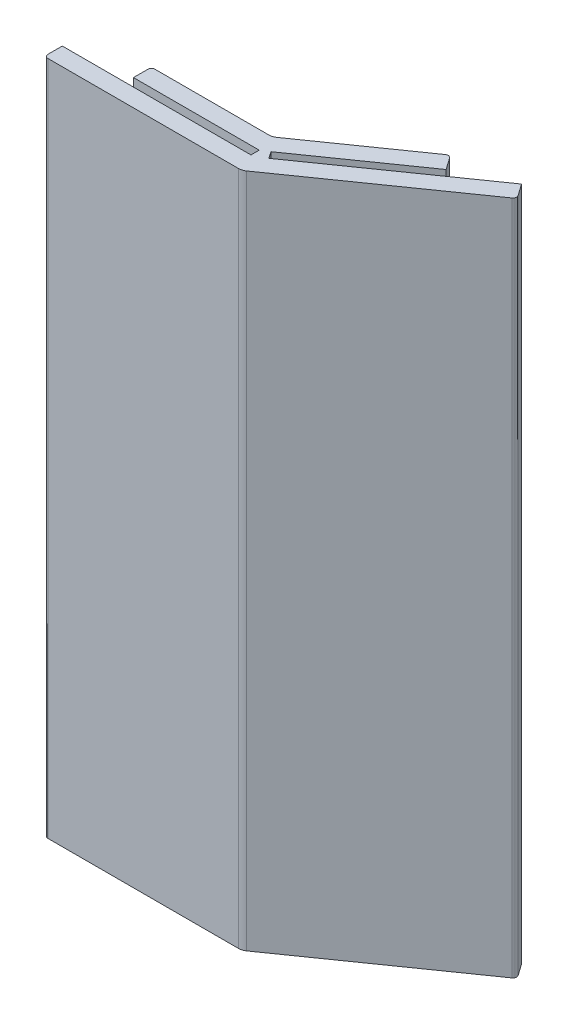
ISO-10303-21;
HEADER;
FILE_DESCRIPTION(('STEP AP214'),'2;1');
FILE_NAME('part.step','',(''),(''),'','','');
FILE_SCHEMA(('AUTOMOTIVE_DESIGN { 1 0 10303 214 1 1 1 1 }'));
ENDSEC;
DATA;
#1=APPLICATION_CONTEXT('core data for automotive mechanical design processes');
#2=APPLICATION_PROTOCOL_DEFINITION('international standard','automotive_design',2000,#1);
#3=PRODUCT_CONTEXT('',#1,'mechanical');
#4=PRODUCT('Part','Part','',(#3));
#5=PRODUCT_RELATED_PRODUCT_CATEGORY('part','',(#4));
#6=PRODUCT_DEFINITION_FORMATION('','',#4);
#7=PRODUCT_DEFINITION_CONTEXT('part definition',#1,'design');
#8=PRODUCT_DEFINITION('design','',#6,#7);
#9=PRODUCT_DEFINITION_SHAPE('','',#8);
#10=(LENGTH_UNIT() NAMED_UNIT(*) SI_UNIT(.MILLI.,.METRE.));
#11=(NAMED_UNIT(*) PLANE_ANGLE_UNIT() SI_UNIT($,.RADIAN.));
#12=(NAMED_UNIT(*) SI_UNIT($,.STERADIAN.) SOLID_ANGLE_UNIT());
#13=UNCERTAINTY_MEASURE_WITH_UNIT(LENGTH_MEASURE(1.E-05),#10,'distance_accuracy_value','');
#14=(GEOMETRIC_REPRESENTATION_CONTEXT(3) GLOBAL_UNCERTAINTY_ASSIGNED_CONTEXT((#13)) GLOBAL_UNIT_ASSIGNED_CONTEXT((#10,
#11,#12)) REPRESENTATION_CONTEXT('',''));
#15=CARTESIAN_POINT('',(0.,0.,0.));
#16=DIRECTION('',(0.,0.,1.));
#17=DIRECTION('',(1.,0.,0.));
#18=AXIS2_PLACEMENT_3D('',#15,#16,#17);
#19=CARTESIAN_POINT('',(-55.,188.,-4.99999999999999));
#20=DIRECTION('',(0.,0.,1.));
#21=DIRECTION('',(1.,0.,0.));
#22=AXIS2_PLACEMENT_3D('',#19,#20,#21);
#23=PLANE('',#22);
#24=DIRECTION('',(-1.,0.,0.));
#25=VECTOR('',#24,1.);
#26=CARTESIAN_POINT('',(-55.,0.,-4.99999999999999));
#27=LINE('',#26,#25);
#28=CARTESIAN_POINT('',(-2.48760437909547,0.,-4.99999999999999));
#29=VERTEX_POINT('',#28);
#30=CARTESIAN_POINT('',(-55.,0.,-4.99999999999999));
#31=VERTEX_POINT('',#30);
#32=EDGE_CURVE('E202',#29,#31,#27,.T.);
#33=ORIENTED_EDGE('',*,*,#32,.T.);
#34=DIRECTION('',(0.,-1.,0.));
#35=VECTOR('',#34,1.);
#36=CARTESIAN_POINT('',(-55.,188.,-4.99999999999999));
#37=LINE('',#36,#35);
#38=CARTESIAN_POINT('',(-55.,188.,-4.99999999999999));
#39=VERTEX_POINT('',#38);
#40=EDGE_CURVE('E11',#39,#31,#37,.T.);
#41=ORIENTED_EDGE('',*,*,#40,.F.);
#42=DIRECTION('',(-1.,0.,0.));
#43=VECTOR('',#42,1.);
#44=CARTESIAN_POINT('',(-55.,188.,-4.99999999999999));
#45=LINE('',#44,#43);
#46=CARTESIAN_POINT('',(-2.48760437909547,188.,-4.99999999999999));
#47=VERTEX_POINT('',#46);
#48=EDGE_CURVE('E240',#47,#39,#45,.T.);
#49=ORIENTED_EDGE('',*,*,#48,.F.);
#50=DIRECTION('',(0.,-1.,0.));
#51=VECTOR('',#50,1.);
#52=CARTESIAN_POINT('',(-2.48760437909547,188.,-4.99999999999999));
#53=LINE('',#52,#51);
#54=EDGE_CURVE('E198',#47,#29,#53,.T.);
#55=ORIENTED_EDGE('',*,*,#54,.T.);
#56=EDGE_LOOP('',(#33,#41,#49,#55));
#57=FACE_BOUND('',#56,.T.);
#58=ADVANCED_FACE('F34',(#57),#23,.F.);
#59=CARTESIAN_POINT('',(-55.,188.,-0.999999999999994));
#60=DIRECTION('',(1.,0.,0.));
#61=DIRECTION('',(0.,0.,-1.));
#62=AXIS2_PLACEMENT_3D('',#59,#60,#61);
#63=PLANE('',#62);
#64=DIRECTION('',(0.,0.,1.));
#65=VECTOR('',#64,1.);
#66=CARTESIAN_POINT('',(-55.,0.,-0.999999999999994));
#67=LINE('',#66,#65);
#68=CARTESIAN_POINT('',(-55.,0.,-0.999999999999994));
#69=VERTEX_POINT('',#68);
#70=EDGE_CURVE('E205',#31,#69,#67,.T.);
#71=ORIENTED_EDGE('',*,*,#70,.T.);
#72=DIRECTION('',(0.,-1.,0.));
#73=VECTOR('',#72,1.);
#74=CARTESIAN_POINT('',(-55.,188.,-0.999999999999994));
#75=LINE('',#74,#73);
#76=CARTESIAN_POINT('',(-55.,188.,-0.999999999999994));
#77=VERTEX_POINT('',#76);
#78=EDGE_CURVE('E42',#77,#69,#75,.T.);
#79=ORIENTED_EDGE('',*,*,#78,.F.);
#80=DIRECTION('',(0.,0.,1.));
#81=VECTOR('',#80,1.);
#82=CARTESIAN_POINT('',(-55.,188.,-0.999999999999994));
#83=LINE('',#82,#81);
#84=EDGE_CURVE('E129',#39,#77,#83,.T.);
#85=ORIENTED_EDGE('',*,*,#84,.F.);
#86=ORIENTED_EDGE('',*,*,#40,.T.);
#87=EDGE_LOOP('',(#71,#79,#85,#86));
#88=FACE_BOUND('',#87,.T.);
#89=ADVANCED_FACE('F358',(#88),#63,.F.);
#90=CARTESIAN_POINT('',(-54.,188.,-0.999999999999994));
#91=DIRECTION('',(0.,-1.,0.));
#92=DIRECTION('',(0.,0.,-1.));
#93=AXIS2_PLACEMENT_3D('',#90,#91,#92);
#94=CYLINDRICAL_SURFACE('',#93,1.);
#95=CARTESIAN_POINT('',(-54.,0.,-0.999999999999994));
#96=DIRECTION('',(0.,1.,0.));
#97=DIRECTION('',(0.,0.,1.));
#98=AXIS2_PLACEMENT_3D('',#95,#96,#97);
#99=CIRCLE('',#98,1.);
#100=CARTESIAN_POINT('',(-54.,0.,0.));
#101=VERTEX_POINT('',#100);
#102=EDGE_CURVE('E207',#69,#101,#99,.T.);
#103=ORIENTED_EDGE('',*,*,#102,.T.);
#104=DIRECTION('',(0.,-1.,0.));
#105=VECTOR('',#104,1.);
#106=CARTESIAN_POINT('',(-54.,188.,0.));
#107=LINE('',#106,#105);
#108=CARTESIAN_POINT('',(-54.,188.,0.));
#109=VERTEX_POINT('',#108);
#110=EDGE_CURVE('E283',#109,#101,#107,.T.);
#111=ORIENTED_EDGE('',*,*,#110,.F.);
#112=CARTESIAN_POINT('',(-54.,188.,-0.999999999999994));
#113=DIRECTION('',(0.,1.,0.));
#114=DIRECTION('',(0.,0.,1.));
#115=AXIS2_PLACEMENT_3D('',#112,#113,#114);
#116=CIRCLE('',#115,1.);
#117=EDGE_CURVE('E291',#77,#109,#116,.T.);
#118=ORIENTED_EDGE('',*,*,#117,.F.);
#119=ORIENTED_EDGE('',*,*,#78,.T.);
#120=EDGE_LOOP('',(#103,#111,#118,#119));
#121=FACE_BOUND('',#120,.T.);
#122=ADVANCED_FACE('F289',(#121),#94,.T.);
#123=CARTESIAN_POINT('',(-0.945896366636942,188.,0.));
#124=DIRECTION('',(0.,0.,-1.));
#125=DIRECTION('',(-1.,0.,0.));
#126=AXIS2_PLACEMENT_3D('',#123,#124,#125);
#127=PLANE('',#126);
#128=DIRECTION('',(1.,0.,0.));
#129=VECTOR('',#128,1.);
#130=CARTESIAN_POINT('',(-0.945896366636942,0.,0.));
#131=LINE('',#130,#129);
#132=CARTESIAN_POINT('',(-0.945896366636942,0.,0.));
#133=VERTEX_POINT('',#132);
#134=EDGE_CURVE('E209',#101,#133,#131,.T.);
#135=ORIENTED_EDGE('',*,*,#134,.T.);
#136=DIRECTION('',(0.,-1.,0.));
#137=VECTOR('',#136,1.);
#138=CARTESIAN_POINT('',(-0.945896366636942,188.,0.));
#139=LINE('',#138,#137);
#140=CARTESIAN_POINT('',(-0.945896366636942,188.,0.));
#141=VERTEX_POINT('',#140);
#142=EDGE_CURVE('E280',#141,#133,#139,.T.);
#143=ORIENTED_EDGE('',*,*,#142,.F.);
#144=DIRECTION('',(1.,0.,0.));
#145=VECTOR('',#144,1.);
#146=CARTESIAN_POINT('',(-0.945896366636942,188.,0.));
#147=LINE('',#146,#145);
#148=EDGE_CURVE('E309',#109,#141,#147,.T.);
#149=ORIENTED_EDGE('',*,*,#148,.F.);
#150=ORIENTED_EDGE('',*,*,#110,.T.);
#151=EDGE_LOOP('',(#135,#143,#149,#150));
#152=FACE_BOUND('',#151,.T.);
#153=ADVANCED_FACE('F300',(#152),#127,.F.);
#154=CARTESIAN_POINT('',(-0.945896366636942,188.,-3.));
#155=DIRECTION('',(0.,-1.,0.));
#156=DIRECTION('',(0.,0.,-1.));
#157=AXIS2_PLACEMENT_3D('',#154,#155,#156);
#158=CYLINDRICAL_SURFACE('',#157,3.);
#159=CARTESIAN_POINT('',(-0.945896366636942,0.,-3.));
#160=DIRECTION('',(0.,1.,0.));
#161=DIRECTION('',(0.,0.,-1.));
#162=AXIS2_PLACEMENT_3D('',#159,#160,#161);
#163=CIRCLE('',#162,3.);
#164=CARTESIAN_POINT('',(0.774832942416184,0.,-0.542543867133016));
#165=VERTEX_POINT('',#164);
#166=EDGE_CURVE('E211',#133,#165,#163,.T.);
#167=ORIENTED_EDGE('',*,*,#166,.T.);
#168=DIRECTION('',(0.,-1.,0.));
#169=VECTOR('',#168,1.);
#170=CARTESIAN_POINT('',(0.774832942416184,188.,-0.542543867133016));
#171=LINE('',#170,#169);
#172=CARTESIAN_POINT('',(0.774832942416184,188.,-0.542543867133016));
#173=VERTEX_POINT('',#172);
#174=EDGE_CURVE('E277',#173,#165,#171,.T.);
#175=ORIENTED_EDGE('',*,*,#174,.F.);
#176=CARTESIAN_POINT('',(-0.945896366636942,188.,-3.));
#177=DIRECTION('',(0.,1.,0.));
#178=DIRECTION('',(0.,0.,-1.));
#179=AXIS2_PLACEMENT_3D('',#176,#177,#178);
#180=CIRCLE('',#179,3.);
#181=EDGE_CURVE('E306',#141,#173,#180,.T.);
#182=ORIENTED_EDGE('',*,*,#181,.F.);
#183=ORIENTED_EDGE('',*,*,#142,.T.);
#184=EDGE_LOOP('',(#167,#175,#182,#183));
#185=FACE_BOUND('',#184,.T.);
#186=ADVANCED_FACE('F304',(#185),#158,.T.);
#187=CARTESIAN_POINT('',(0.774832942416183,188.,-0.542543867133016));
#188=DIRECTION('',(-0.573576436351042,0.,-0.819152044288995));
#189=DIRECTION('',(-0.819152044288995,0.,0.573576436351042));
#190=AXIS2_PLACEMENT_3D('',#187,#188,#189);
#191=PLANE('',#190);
#192=DIRECTION('',(0.819152044288995,0.,-0.573576436351042));
#193=VECTOR('',#192,1.);
#194=CARTESIAN_POINT('',(0.774832942416183,0.,-0.542543867133016));
#195=LINE('',#194,#193);
#196=CARTESIAN_POINT('',(44.2342103916057,0.,-30.9731275629563));
#197=VERTEX_POINT('',#196);
#198=EDGE_CURVE('E213',#165,#197,#195,.T.);
#199=ORIENTED_EDGE('',*,*,#198,.T.);
#200=DIRECTION('',(0.,-1.,0.));
#201=VECTOR('',#200,1.);
#202=CARTESIAN_POINT('',(44.2342103916057,188.,-30.9731275629563));
#203=LINE('',#202,#201);
#204=CARTESIAN_POINT('',(44.2342103916057,188.,-30.9731275629563));
#205=VERTEX_POINT('',#204);
#206=EDGE_CURVE('E274',#205,#197,#203,.T.);
#207=ORIENTED_EDGE('',*,*,#206,.F.);
#208=DIRECTION('',(0.819152044288995,0.,-0.573576436351042));
#209=VECTOR('',#208,1.);
#210=CARTESIAN_POINT('',(0.774832942416183,188.,-0.542543867133016));
#211=LINE('',#210,#209);
#212=EDGE_CURVE('E308',#173,#205,#211,.T.);
#213=ORIENTED_EDGE('',*,*,#212,.F.);
#214=ORIENTED_EDGE('',*,*,#174,.T.);
#215=EDGE_LOOP('',(#199,#207,#213,#214));
#216=FACE_BOUND('',#215,.T.);
#217=ADVANCED_FACE('F371',(#216),#191,.F.);
#218=CARTESIAN_POINT('',(43.6606339552547,188.,-31.7922796072453));
#219=DIRECTION('',(0.,-1.,0.));
#220=DIRECTION('',(0.,0.,-1.));
#221=AXIS2_PLACEMENT_3D('',#218,#219,#220);
#222=CYLINDRICAL_SURFACE('',#221,0.999999999999994);
#223=CARTESIAN_POINT('',(43.6606339552547,0.,-31.7922796072453));
#224=DIRECTION('',(0.,1.,0.));
#225=DIRECTION('',(0.,0.,1.));
#226=AXIS2_PLACEMENT_3D('',#223,#224,#225);
#227=CIRCLE('',#226,0.999999999999994);
#228=CARTESIAN_POINT('',(44.4797859995437,0.,-32.3658560435963));
#229=VERTEX_POINT('',#228);
#230=EDGE_CURVE('E215',#197,#229,#227,.T.);
#231=ORIENTED_EDGE('',*,*,#230,.T.);
#232=DIRECTION('',(0.,-1.,0.));
#233=VECTOR('',#232,1.);
#234=CARTESIAN_POINT('',(44.4797859995437,188.,-32.3658560435963));
#235=LINE('',#234,#233);
#236=CARTESIAN_POINT('',(44.4797859995437,188.,-32.3658560435963));
#237=VERTEX_POINT('',#236);
#238=EDGE_CURVE('E271',#237,#229,#235,.T.);
#239=ORIENTED_EDGE('',*,*,#238,.F.);
#240=CARTESIAN_POINT('',(43.6606339552547,188.,-31.7922796072453));
#241=DIRECTION('',(0.,1.,0.));
#242=DIRECTION('',(0.,0.,1.));
#243=AXIS2_PLACEMENT_3D('',#240,#241,#242);
#244=CIRCLE('',#243,0.999999999999994);
#245=EDGE_CURVE('E311',#205,#237,#244,.T.);
#246=ORIENTED_EDGE('',*,*,#245,.F.);
#247=ORIENTED_EDGE('',*,*,#206,.T.);
#248=EDGE_LOOP('',(#231,#239,#246,#247));
#249=FACE_BOUND('',#248,.T.);
#250=ADVANCED_FACE('F374',(#249),#222,.T.);
#251=CARTESIAN_POINT('',(42.1854802541395,188.,-35.6424642207523));
#252=DIRECTION('',(-0.819152044288995,0.,0.573576436351042));
#253=DIRECTION('',(0.573576436351042,0.,0.819152044288995));
#254=AXIS2_PLACEMENT_3D('',#251,#252,#253);
#255=PLANE('',#254);
#256=DIRECTION('',(-0.573576436351042,0.,-0.819152044288995));
#257=VECTOR('',#256,1.);
#258=CARTESIAN_POINT('',(42.1854802541395,0.,-35.6424642207523));
#259=LINE('',#258,#257);
#260=CARTESIAN_POINT('',(42.1854802541395,0.,-35.6424642207523));
#261=VERTEX_POINT('',#260);
#262=EDGE_CURVE('E217',#229,#261,#259,.T.);
#263=ORIENTED_EDGE('',*,*,#262,.T.);
#264=DIRECTION('',(0.,-1.,0.));
#265=VECTOR('',#264,1.);
#266=CARTESIAN_POINT('',(42.1854802541395,188.,-35.6424642207523));
#267=LINE('',#266,#265);
#268=CARTESIAN_POINT('',(42.1854802541395,188.,-35.6424642207523));
#269=VERTEX_POINT('',#268);
#270=EDGE_CURVE('E268',#269,#261,#267,.T.);
#271=ORIENTED_EDGE('',*,*,#270,.F.);
#272=DIRECTION('',(-0.573576436351042,0.,-0.819152044288995));
#273=VECTOR('',#272,1.);
#274=CARTESIAN_POINT('',(42.1854802541395,188.,-35.6424642207523));
#275=LINE('',#274,#273);
#276=EDGE_CURVE('E317',#237,#269,#275,.T.);
#277=ORIENTED_EDGE('',*,*,#276,.F.);
#278=ORIENTED_EDGE('',*,*,#238,.T.);
#279=EDGE_LOOP('',(#263,#271,#277,#278));
#280=FACE_BOUND('',#279,.T.);
#281=ADVANCED_FACE('F378',(#280),#255,.F.);
#282=CARTESIAN_POINT('',(0.825534162884214,188.,-6.68191818770841));
#283=DIRECTION('',(0.573576436351042,0.,0.819152044288995));
#284=DIRECTION('',(0.819152044288995,0.,-0.573576436351042));
#285=AXIS2_PLACEMENT_3D('',#282,#283,#284);
#286=PLANE('',#285);
#287=DIRECTION('',(-0.819152044288995,0.,0.573576436351042));
#288=VECTOR('',#287,1.);
#289=CARTESIAN_POINT('',(0.825534162884214,0.,-6.68191818770841));
#290=LINE('',#289,#288);
#291=CARTESIAN_POINT('',(0.825534162884214,0.,-6.68191818770841));
#292=VERTEX_POINT('',#291);
#293=EDGE_CURVE('E219',#261,#292,#290,.T.);
#294=ORIENTED_EDGE('',*,*,#293,.T.);
#295=DIRECTION('',(0.,-1.,0.));
#296=VECTOR('',#295,1.);
#297=CARTESIAN_POINT('',(0.825534162884214,188.,-6.68191818770841));
#298=LINE('',#297,#296);
#299=CARTESIAN_POINT('',(0.825534162884214,188.,-6.68191818770841));
#300=VERTEX_POINT('',#299);
#301=EDGE_CURVE('E265',#300,#292,#298,.T.);
#302=ORIENTED_EDGE('',*,*,#301,.F.);
#303=DIRECTION('',(-0.819152044288995,0.,0.573576436351042));
#304=VECTOR('',#303,1.);
#305=CARTESIAN_POINT('',(0.825534162884214,188.,-6.68191818770841));
#306=LINE('',#305,#304);
#307=EDGE_CURVE('E319',#269,#300,#306,.T.);
#308=ORIENTED_EDGE('',*,*,#307,.F.);
#309=ORIENTED_EDGE('',*,*,#270,.T.);
#310=EDGE_LOOP('',(#294,#302,#308,#309));
#311=FACE_BOUND('',#310,.T.);
#312=ADVANCED_FACE('F382',(#311),#286,.F.);
#313=CARTESIAN_POINT('',(-0.493691640723176,188.,-8.56596788957309));
#314=DIRECTION('',(-0.819152044288995,0.,0.573576436351042));
#315=DIRECTION('',(0.573576436351042,0.,0.819152044288995));
#316=AXIS2_PLACEMENT_3D('',#313,#314,#315);
#317=PLANE('',#316);
#318=DIRECTION('',(-0.573576436351042,0.,-0.819152044288995));
#319=VECTOR('',#318,1.);
#320=CARTESIAN_POINT('',(-0.493691640723176,0.,-8.56596788957309));
#321=LINE('',#320,#319);
#322=CARTESIAN_POINT('',(-0.493691640723176,0.,-8.56596788957309));
#323=VERTEX_POINT('',#322);
#324=EDGE_CURVE('E221',#292,#323,#321,.T.);
#325=ORIENTED_EDGE('',*,*,#324,.T.);
#326=DIRECTION('',(0.,-1.,0.));
#327=VECTOR('',#326,1.);
#328=CARTESIAN_POINT('',(-0.493691640723176,188.,-8.56596788957309));
#329=LINE('',#328,#327);
#330=CARTESIAN_POINT('',(-0.493691640723176,188.,-8.56596788957309));
#331=VERTEX_POINT('',#330);
#332=EDGE_CURVE('E262',#331,#323,#329,.T.);
#333=ORIENTED_EDGE('',*,*,#332,.F.);
#334=DIRECTION('',(-0.573576436351042,0.,-0.819152044288995));
#335=VECTOR('',#334,1.);
#336=CARTESIAN_POINT('',(-0.493691640723176,188.,-8.56596788957309));
#337=LINE('',#336,#335);
#338=EDGE_CURVE('E321',#300,#331,#337,.T.);
#339=ORIENTED_EDGE('',*,*,#338,.F.);
#340=ORIENTED_EDGE('',*,*,#301,.T.);
#341=EDGE_LOOP('',(#325,#333,#339,#340));
#342=FACE_BOUND('',#341,.T.);
#343=ADVANCED_FACE('F386',(#342),#317,.F.);
#344=CARTESIAN_POINT('',(28.1766299093916,188.,-28.6411431618596));
#345=DIRECTION('',(-0.573576436351042,0.,-0.819152044288995));
#346=DIRECTION('',(-0.819152044288995,0.,0.573576436351042));
#347=AXIS2_PLACEMENT_3D('',#344,#345,#346);
#348=PLANE('',#347);
#349=DIRECTION('',(0.819152044288994,0.,-0.573576436351042));
#350=VECTOR('',#349,1.);
#351=CARTESIAN_POINT('',(28.1766299093916,0.,-28.6411431618596));
#352=LINE('',#351,#350);
#353=CARTESIAN_POINT('',(28.1766299093916,0.,-28.6411431618596));
#354=VERTEX_POINT('',#353);
#355=EDGE_CURVE('E223',#323,#354,#352,.T.);
#356=ORIENTED_EDGE('',*,*,#355,.T.);
#357=DIRECTION('',(0.,-1.,0.));
#358=VECTOR('',#357,1.);
#359=CARTESIAN_POINT('',(28.1766299093916,188.,-28.6411431618596));
#360=LINE('',#359,#358);
#361=CARTESIAN_POINT('',(28.1766299093916,188.,-28.6411431618596));
#362=VERTEX_POINT('',#361);
#363=EDGE_CURVE('E259',#362,#354,#360,.T.);
#364=ORIENTED_EDGE('',*,*,#363,.F.);
#365=DIRECTION('',(0.819152044288994,0.,-0.573576436351042));
#366=VECTOR('',#365,1.);
#367=CARTESIAN_POINT('',(28.1766299093916,188.,-28.6411431618596));
#368=LINE('',#367,#366);
#369=EDGE_CURVE('E323',#331,#362,#368,.T.);
#370=ORIENTED_EDGE('',*,*,#369,.F.);
#371=ORIENTED_EDGE('',*,*,#332,.T.);
#372=EDGE_LOOP('',(#356,#364,#370,#371));
#373=FACE_BOUND('',#372,.T.);
#374=ADVANCED_FACE('F390',(#373),#348,.F.);
#375=CARTESIAN_POINT('',(25.8823241639875,188.,-31.9177513390155));
#376=DIRECTION('',(-0.819152044288994,0.,0.573576436351043));
#377=DIRECTION('',(0.573576436351043,0.,0.819152044288994));
#378=AXIS2_PLACEMENT_3D('',#375,#376,#377);
#379=PLANE('',#378);
#380=DIRECTION('',(-0.573576436351043,0.,-0.819152044288994));
#381=VECTOR('',#380,1.);
#382=CARTESIAN_POINT('',(25.8823241639875,0.,-31.9177513390155));
#383=LINE('',#382,#381);
#384=CARTESIAN_POINT('',(25.8823241639875,0.,-31.9177513390155));
#385=VERTEX_POINT('',#384);
#386=EDGE_CURVE('E225',#354,#385,#383,.T.);
#387=ORIENTED_EDGE('',*,*,#386,.T.);
#388=DIRECTION('',(0.,-1.,0.));
#389=VECTOR('',#388,1.);
#390=CARTESIAN_POINT('',(25.8823241639875,188.,-31.9177513390155));
#391=LINE('',#390,#389);
#392=CARTESIAN_POINT('',(25.8823241639875,188.,-31.9177513390155));
#393=VERTEX_POINT('',#392);
#394=EDGE_CURVE('E256',#393,#385,#391,.T.);
#395=ORIENTED_EDGE('',*,*,#394,.F.);
#396=DIRECTION('',(-0.573576436351043,0.,-0.819152044288994));
#397=VECTOR('',#396,1.);
#398=CARTESIAN_POINT('',(25.8823241639875,188.,-31.9177513390155));
#399=LINE('',#398,#397);
#400=EDGE_CURVE('E325',#362,#393,#399,.T.);
#401=ORIENTED_EDGE('',*,*,#400,.F.);
#402=ORIENTED_EDGE('',*,*,#363,.T.);
#403=EDGE_LOOP('',(#387,#395,#401,#402));
#404=FACE_BOUND('',#403,.T.);
#405=ADVANCED_FACE('F394',(#404),#379,.F.);
#406=CARTESIAN_POINT('',(25.0631721196985,188.,-31.3441749026645));
#407=DIRECTION('',(0.,-1.,0.));
#408=DIRECTION('',(0.,0.,-1.));
#409=AXIS2_PLACEMENT_3D('',#406,#407,#408);
#410=CYLINDRICAL_SURFACE('',#409,1.);
#411=CARTESIAN_POINT('',(25.0631721196985,0.,-31.3441749026645));
#412=DIRECTION('',(0.,1.,0.));
#413=DIRECTION('',(0.,0.,1.));
#414=AXIS2_PLACEMENT_3D('',#411,#412,#413);
#415=CIRCLE('',#414,1.);
#416=CARTESIAN_POINT('',(24.4895956833474,0.,-32.1633269469535));
#417=VERTEX_POINT('',#416);
#418=EDGE_CURVE('E227',#385,#417,#415,.T.);
#419=ORIENTED_EDGE('',*,*,#418,.T.);
#420=DIRECTION('',(0.,-1.,0.));
#421=VECTOR('',#420,1.);
#422=CARTESIAN_POINT('',(24.4895956833474,188.,-32.1633269469535));
#423=LINE('',#422,#421);
#424=CARTESIAN_POINT('',(24.4895956833474,188.,-32.1633269469535));
#425=VERTEX_POINT('',#424);
#426=EDGE_CURVE('E253',#425,#417,#423,.T.);
#427=ORIENTED_EDGE('',*,*,#426,.F.);
#428=CARTESIAN_POINT('',(25.0631721196985,188.,-31.3441749026645));
#429=DIRECTION('',(0.,1.,0.));
#430=DIRECTION('',(0.,0.,1.));
#431=AXIS2_PLACEMENT_3D('',#428,#429,#430);
#432=CIRCLE('',#431,1.);
#433=EDGE_CURVE('E327',#393,#425,#432,.T.);
#434=ORIENTED_EDGE('',*,*,#433,.F.);
#435=ORIENTED_EDGE('',*,*,#394,.T.);
#436=EDGE_LOOP('',(#419,#427,#434,#435));
#437=FACE_BOUND('',#436,.T.);
#438=ADVANCED_FACE('F398',(#437),#410,.T.);
#439=CARTESIAN_POINT('',(-3.10334216079525,188.,-12.842543867133));
#440=DIRECTION('',(0.573576436351042,0.,0.819152044288995));
#441=DIRECTION('',(0.819152044288995,0.,-0.573576436351042));
#442=AXIS2_PLACEMENT_3D('',#439,#440,#441);
#443=PLANE('',#442);
#444=DIRECTION('',(-0.819152044288995,0.,0.573576436351042));
#445=VECTOR('',#444,1.);
#446=CARTESIAN_POINT('',(-3.10334216079525,0.,-12.842543867133));
#447=LINE('',#446,#445);
#448=CARTESIAN_POINT('',(-3.10334216079525,0.,-12.842543867133));
#449=VERTEX_POINT('',#448);
#450=EDGE_CURVE('E229',#417,#449,#447,.T.);
#451=ORIENTED_EDGE('',*,*,#450,.T.);
#452=DIRECTION('',(0.,-1.,0.));
#453=VECTOR('',#452,1.);
#454=CARTESIAN_POINT('',(-3.10334216079525,188.,-12.842543867133));
#455=LINE('',#454,#453);
#456=CARTESIAN_POINT('',(-3.10334216079525,188.,-12.842543867133));
#457=VERTEX_POINT('',#456);
#458=EDGE_CURVE('E250',#457,#449,#455,.T.);
#459=ORIENTED_EDGE('',*,*,#458,.F.);
#460=DIRECTION('',(-0.819152044288995,0.,0.573576436351042));
#461=VECTOR('',#460,1.);
#462=CARTESIAN_POINT('',(-3.10334216079525,188.,-12.842543867133));
#463=LINE('',#462,#461);
#464=EDGE_CURVE('E329',#425,#457,#463,.T.);
#465=ORIENTED_EDGE('',*,*,#464,.F.);
#466=ORIENTED_EDGE('',*,*,#426,.T.);
#467=EDGE_LOOP('',(#451,#459,#465,#466));
#468=FACE_BOUND('',#467,.T.);
#469=ADVANCED_FACE('F402',(#468),#443,.F.);
#470=CARTESIAN_POINT('',(-4.82407146984837,188.,-15.3));
#471=DIRECTION('',(0.,-1.,0.));
#472=DIRECTION('',(0.,0.,-1.));
#473=AXIS2_PLACEMENT_3D('',#470,#471,#472);
#474=CYLINDRICAL_SURFACE('',#473,3.);
#475=CARTESIAN_POINT('',(-4.82407146984837,0.,-15.3));
#476=DIRECTION('',(0.,-1.,0.));
#477=DIRECTION('',(0.,0.,1.));
#478=AXIS2_PLACEMENT_3D('',#475,#476,#477);
#479=CIRCLE('',#478,3.);
#480=CARTESIAN_POINT('',(-4.82407146984837,0.,-12.3));
#481=VERTEX_POINT('',#480);
#482=EDGE_CURVE('E231',#449,#481,#479,.T.);
#483=ORIENTED_EDGE('',*,*,#482,.T.);
#484=DIRECTION('',(0.,-1.,0.));
#485=VECTOR('',#484,1.);
#486=CARTESIAN_POINT('',(-4.82407146984837,188.,-12.3));
#487=LINE('',#486,#485);
#488=CARTESIAN_POINT('',(-4.82407146984837,188.,-12.3));
#489=VERTEX_POINT('',#488);
#490=EDGE_CURVE('E247',#489,#481,#487,.T.);
#491=ORIENTED_EDGE('',*,*,#490,.F.);
#492=CARTESIAN_POINT('',(-4.82407146984837,188.,-15.3));
#493=DIRECTION('',(0.,-1.,0.));
#494=DIRECTION('',(0.,0.,1.));
#495=AXIS2_PLACEMENT_3D('',#492,#493,#494);
#496=CIRCLE('',#495,3.);
#497=EDGE_CURVE('E331',#457,#489,#496,.T.);
#498=ORIENTED_EDGE('',*,*,#497,.F.);
#499=ORIENTED_EDGE('',*,*,#458,.T.);
#500=EDGE_LOOP('',(#483,#491,#498,#499));
#501=FACE_BOUND('',#500,.T.);
#502=ADVANCED_FACE('F406',(#501),#474,.F.);
#503=CARTESIAN_POINT('',(-36.4876043790955,188.,-12.3));
#504=DIRECTION('',(0.,0.,1.));
#505=DIRECTION('',(1.,0.,0.));
#506=AXIS2_PLACEMENT_3D('',#503,#504,#505);
#507=PLANE('',#506);
#508=DIRECTION('',(-1.,0.,0.));
#509=VECTOR('',#508,1.);
#510=CARTESIAN_POINT('',(-36.4876043790955,0.,-12.3));
#511=LINE('',#510,#509);
#512=CARTESIAN_POINT('',(-36.4876043790955,0.,-12.3));
#513=VERTEX_POINT('',#512);
#514=EDGE_CURVE('E233',#481,#513,#511,.T.);
#515=ORIENTED_EDGE('',*,*,#514,.T.);
#516=DIRECTION('',(0.,-1.,0.));
#517=VECTOR('',#516,1.);
#518=CARTESIAN_POINT('',(-36.4876043790955,188.,-12.3));
#519=LINE('',#518,#517);
#520=CARTESIAN_POINT('',(-36.4876043790955,188.,-12.3));
#521=VERTEX_POINT('',#520);
#522=EDGE_CURVE('E244',#521,#513,#519,.T.);
#523=ORIENTED_EDGE('',*,*,#522,.F.);
#524=DIRECTION('',(-1.,0.,0.));
#525=VECTOR('',#524,1.);
#526=CARTESIAN_POINT('',(-36.4876043790955,188.,-12.3));
#527=LINE('',#526,#525);
#528=EDGE_CURVE('E333',#489,#521,#527,.T.);
#529=ORIENTED_EDGE('',*,*,#528,.F.);
#530=ORIENTED_EDGE('',*,*,#490,.T.);
#531=EDGE_LOOP('',(#515,#523,#529,#530));
#532=FACE_BOUND('',#531,.T.);
#533=ADVANCED_FACE('F339',(#532),#507,.F.);
#534=CARTESIAN_POINT('',(-36.4876043790955,188.,-11.3));
#535=DIRECTION('',(0.,-1.,0.));
#536=DIRECTION('',(0.,0.,-1.));
#537=AXIS2_PLACEMENT_3D('',#534,#535,#536);
#538=CYLINDRICAL_SURFACE('',#537,0.999999999999997);
#539=CARTESIAN_POINT('',(-36.4876043790955,0.,-11.3));
#540=DIRECTION('',(0.,1.,0.));
#541=DIRECTION('',(0.,0.,-1.));
#542=AXIS2_PLACEMENT_3D('',#539,#540,#541);
#543=CIRCLE('',#542,0.999999999999997);
#544=CARTESIAN_POINT('',(-37.4876043790955,0.,-11.3));
#545=VERTEX_POINT('',#544);
#546=EDGE_CURVE('E235',#513,#545,#543,.T.);
#547=ORIENTED_EDGE('',*,*,#546,.T.);
#548=DIRECTION('',(0.,-1.,0.));
#549=VECTOR('',#548,1.);
#550=CARTESIAN_POINT('',(-37.4876043790955,188.,-11.3));
#551=LINE('',#550,#549);
#552=CARTESIAN_POINT('',(-37.4876043790955,188.,-11.3));
#553=VERTEX_POINT('',#552);
#554=EDGE_CURVE('E193',#553,#545,#551,.T.);
#555=ORIENTED_EDGE('',*,*,#554,.F.);
#556=CARTESIAN_POINT('',(-36.4876043790955,188.,-11.3));
#557=DIRECTION('',(0.,1.,0.));
#558=DIRECTION('',(0.,0.,-1.));
#559=AXIS2_PLACEMENT_3D('',#556,#557,#558);
#560=CIRCLE('',#559,0.999999999999997);
#561=EDGE_CURVE('E184',#521,#553,#560,.T.);
#562=ORIENTED_EDGE('',*,*,#561,.F.);
#563=ORIENTED_EDGE('',*,*,#522,.T.);
#564=EDGE_LOOP('',(#547,#555,#562,#563));
#565=FACE_BOUND('',#564,.T.);
#566=ADVANCED_FACE('F343',(#565),#538,.T.);
#567=CARTESIAN_POINT('',(-37.4876043790955,188.,-7.29999999999999));
#568=DIRECTION('',(1.,0.,0.));
#569=DIRECTION('',(0.,0.,-1.));
#570=AXIS2_PLACEMENT_3D('',#567,#568,#569);
#571=PLANE('',#570);
#572=DIRECTION('',(0.,0.,1.));
#573=VECTOR('',#572,1.);
#574=CARTESIAN_POINT('',(-37.4876043790955,0.,-7.29999999999999));
#575=LINE('',#574,#573);
#576=CARTESIAN_POINT('',(-37.4876043790955,0.,-7.29999999999999));
#577=VERTEX_POINT('',#576);
#578=EDGE_CURVE('E192',#545,#577,#575,.T.);
#579=ORIENTED_EDGE('',*,*,#578,.T.);
#580=DIRECTION('',(0.,-1.,0.));
#581=VECTOR('',#580,1.);
#582=CARTESIAN_POINT('',(-37.4876043790955,188.,-7.29999999999999));
#583=LINE('',#582,#581);
#584=CARTESIAN_POINT('',(-37.4876043790955,188.,-7.29999999999999));
#585=VERTEX_POINT('',#584);
#586=EDGE_CURVE('E189',#585,#577,#583,.T.);
#587=ORIENTED_EDGE('',*,*,#586,.F.);
#588=DIRECTION('',(0.,0.,1.));
#589=VECTOR('',#588,1.);
#590=CARTESIAN_POINT('',(-37.4876043790955,188.,-7.29999999999999));
#591=LINE('',#590,#589);
#592=EDGE_CURVE('E178',#553,#585,#591,.T.);
#593=ORIENTED_EDGE('',*,*,#592,.F.);
#594=ORIENTED_EDGE('',*,*,#554,.T.);
#595=EDGE_LOOP('',(#579,#587,#593,#594));
#596=FACE_BOUND('',#595,.T.);
#597=ADVANCED_FACE('F190',(#596),#571,.F.);
#598=CARTESIAN_POINT('',(-2.48760437909547,188.,-7.29999999999999));
#599=DIRECTION('',(0.,0.,-1.));
#600=DIRECTION('',(-1.,0.,0.));
#601=AXIS2_PLACEMENT_3D('',#598,#599,#600);
#602=PLANE('',#601);
#603=DIRECTION('',(1.,0.,0.));
#604=VECTOR('',#603,1.);
#605=CARTESIAN_POINT('',(-2.48760437909547,0.,-7.29999999999999));
#606=LINE('',#605,#604);
#607=CARTESIAN_POINT('',(-2.48760437909547,0.,-7.29999999999999));
#608=VERTEX_POINT('',#607);
#609=EDGE_CURVE('E115',#577,#608,#606,.T.);
#610=ORIENTED_EDGE('',*,*,#609,.T.);
#611=DIRECTION('',(0.,-1.,0.));
#612=VECTOR('',#611,1.);
#613=CARTESIAN_POINT('',(-2.48760437909547,188.,-7.29999999999999));
#614=LINE('',#613,#612);
#615=CARTESIAN_POINT('',(-2.48760437909547,188.,-7.29999999999999));
#616=VERTEX_POINT('',#615);
#617=EDGE_CURVE('E194',#616,#608,#614,.T.);
#618=ORIENTED_EDGE('',*,*,#617,.F.);
#619=DIRECTION('',(1.,0.,0.));
#620=VECTOR('',#619,1.);
#621=CARTESIAN_POINT('',(-2.48760437909547,188.,-7.29999999999999));
#622=LINE('',#621,#620);
#623=EDGE_CURVE('E182',#585,#616,#622,.T.);
#624=ORIENTED_EDGE('',*,*,#623,.F.);
#625=ORIENTED_EDGE('',*,*,#586,.T.);
#626=EDGE_LOOP('',(#610,#618,#624,#625));
#627=FACE_BOUND('',#626,.T.);
#628=ADVANCED_FACE('F196',(#627),#602,.F.);
#629=CARTESIAN_POINT('',(-2.48760437909547,188.,-4.99999999999999));
#630=DIRECTION('',(1.,0.,0.));
#631=DIRECTION('',(0.,0.,-1.));
#632=AXIS2_PLACEMENT_3D('',#629,#630,#631);
#633=PLANE('',#632);
#634=DIRECTION('',(0.,0.,1.));
#635=VECTOR('',#634,1.);
#636=CARTESIAN_POINT('',(-2.48760437909547,0.,-4.99999999999999));
#637=LINE('',#636,#635);
#638=EDGE_CURVE('E121',#608,#29,#637,.T.);
#639=ORIENTED_EDGE('',*,*,#638,.T.);
#640=ORIENTED_EDGE('',*,*,#54,.F.);
#641=DIRECTION('',(0.,0.,1.));
#642=VECTOR('',#641,1.);
#643=CARTESIAN_POINT('',(-2.48760437909547,188.,-4.99999999999999));
#644=LINE('',#643,#642);
#645=EDGE_CURVE('E50',#616,#47,#644,.T.);
#646=ORIENTED_EDGE('',*,*,#645,.F.);
#647=ORIENTED_EDGE('',*,*,#617,.T.);
#648=EDGE_LOOP('',(#639,#640,#646,#647));
#649=FACE_BOUND('',#648,.T.);
#650=ADVANCED_FACE('F347',(#649),#633,.F.);
#651=CARTESIAN_POINT('',(-36.4876043790955,188.,-11.3));
#652=DIRECTION('',(0.,-1.,0.));
#653=DIRECTION('',(0.,0.,-1.));
#654=AXIS2_PLACEMENT_3D('',#651,#652,#653);
#655=PLANE('',#654);
#656=ORIENTED_EDGE('',*,*,#48,.T.);
#657=ORIENTED_EDGE('',*,*,#84,.T.);
#658=ORIENTED_EDGE('',*,*,#117,.T.);
#659=ORIENTED_EDGE('',*,*,#148,.T.);
#660=ORIENTED_EDGE('',*,*,#181,.T.);
#661=ORIENTED_EDGE('',*,*,#212,.T.);
#662=ORIENTED_EDGE('',*,*,#245,.T.);
#663=ORIENTED_EDGE('',*,*,#276,.T.);
#664=ORIENTED_EDGE('',*,*,#307,.T.);
#665=ORIENTED_EDGE('',*,*,#338,.T.);
#666=ORIENTED_EDGE('',*,*,#369,.T.);
#667=ORIENTED_EDGE('',*,*,#400,.T.);
#668=ORIENTED_EDGE('',*,*,#433,.T.);
#669=ORIENTED_EDGE('',*,*,#464,.T.);
#670=ORIENTED_EDGE('',*,*,#497,.T.);
#671=ORIENTED_EDGE('',*,*,#528,.T.);
#672=ORIENTED_EDGE('',*,*,#561,.T.);
#673=ORIENTED_EDGE('',*,*,#592,.T.);
#674=ORIENTED_EDGE('',*,*,#623,.T.);
#675=ORIENTED_EDGE('',*,*,#645,.T.);
#676=EDGE_LOOP('',(#656,#657,#658,#659,#660,#661,#662,#663,#664,#665,#666,#667,#668,#669,#670,
#671,#672,#673,#674,#675));
#677=FACE_BOUND('',#676,.T.);
#678=ADVANCED_FACE('F180',(#677),#655,.F.);
#679=CARTESIAN_POINT('',(-36.4876043790955,0.,-11.3));
#680=DIRECTION('',(0.,-1.,0.));
#681=DIRECTION('',(0.,0.,-1.));
#682=AXIS2_PLACEMENT_3D('',#679,#680,#681);
#683=PLANE('',#682);
#684=ORIENTED_EDGE('',*,*,#32,.F.);
#685=ORIENTED_EDGE('',*,*,#638,.F.);
#686=ORIENTED_EDGE('',*,*,#609,.F.);
#687=ORIENTED_EDGE('',*,*,#578,.F.);
#688=ORIENTED_EDGE('',*,*,#546,.F.);
#689=ORIENTED_EDGE('',*,*,#514,.F.);
#690=ORIENTED_EDGE('',*,*,#482,.F.);
#691=ORIENTED_EDGE('',*,*,#450,.F.);
#692=ORIENTED_EDGE('',*,*,#418,.F.);
#693=ORIENTED_EDGE('',*,*,#386,.F.);
#694=ORIENTED_EDGE('',*,*,#355,.F.);
#695=ORIENTED_EDGE('',*,*,#324,.F.);
#696=ORIENTED_EDGE('',*,*,#293,.F.);
#697=ORIENTED_EDGE('',*,*,#262,.F.);
#698=ORIENTED_EDGE('',*,*,#230,.F.);
#699=ORIENTED_EDGE('',*,*,#198,.F.);
#700=ORIENTED_EDGE('',*,*,#166,.F.);
#701=ORIENTED_EDGE('',*,*,#134,.F.);
#702=ORIENTED_EDGE('',*,*,#102,.F.);
#703=ORIENTED_EDGE('',*,*,#70,.F.);
#704=EDGE_LOOP('',(#684,#685,#686,#687,#688,#689,#690,#691,#692,#693,#694,#695,#696,#697,#698,
#699,#700,#701,#702,#703));
#705=FACE_BOUND('',#704,.T.);
#706=ADVANCED_FACE('F295',(#705),#683,.T.);
#707=CLOSED_SHELL('',(#58,#89,#122,#153,#186,#217,#250,#281,#312,#343,#374,#405,#438,#469,#502,
#533,#566,#597,#628,#650,#678,#706));
#708=MANIFOLD_SOLID_BREP('B2',#707);
#709=ADVANCED_BREP_SHAPE_REPRESENTATION('',(#18,#708),#14);
#710=SHAPE_DEFINITION_REPRESENTATION(#9,#709);
ENDSEC;
END-ISO-10303-21;
